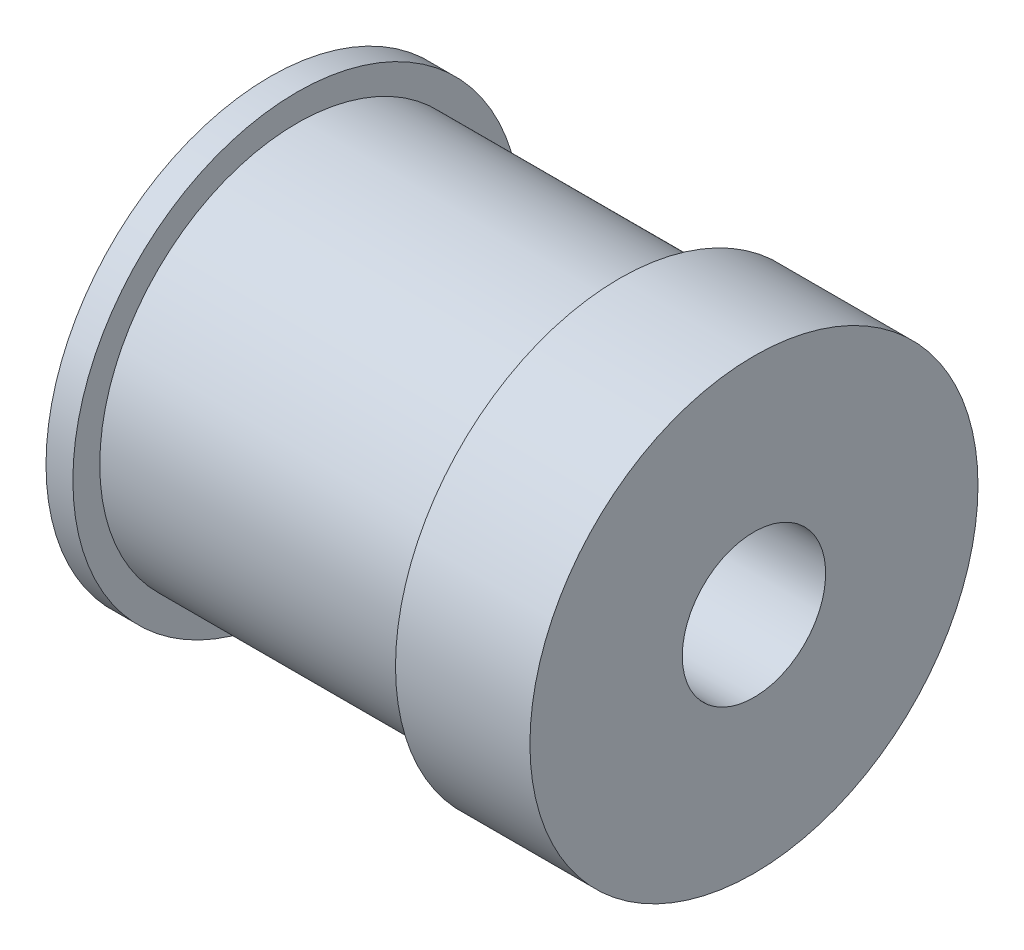
ISO-10303-21;
HEADER;
FILE_DESCRIPTION(('STEP AP214'),'2;1');
FILE_NAME('part.step','',(''),(''),'','','');
FILE_SCHEMA(('AUTOMOTIVE_DESIGN { 1 0 10303 214 1 1 1 1 }'));
ENDSEC;
DATA;
#1=APPLICATION_CONTEXT('core data for automotive mechanical design processes');
#2=APPLICATION_PROTOCOL_DEFINITION('international standard','automotive_design',2000,#1);
#3=PRODUCT_CONTEXT('',#1,'mechanical');
#4=PRODUCT('Part','Part','',(#3));
#5=PRODUCT_RELATED_PRODUCT_CATEGORY('part','',(#4));
#6=PRODUCT_DEFINITION_FORMATION('','',#4);
#7=PRODUCT_DEFINITION_CONTEXT('part definition',#1,'design');
#8=PRODUCT_DEFINITION('design','',#6,#7);
#9=PRODUCT_DEFINITION_SHAPE('','',#8);
#10=(LENGTH_UNIT() NAMED_UNIT(*) SI_UNIT(.MILLI.,.METRE.));
#11=(NAMED_UNIT(*) PLANE_ANGLE_UNIT() SI_UNIT($,.RADIAN.));
#12=(NAMED_UNIT(*) SI_UNIT($,.STERADIAN.) SOLID_ANGLE_UNIT());
#13=UNCERTAINTY_MEASURE_WITH_UNIT(LENGTH_MEASURE(1.E-05),#10,'distance_accuracy_value','');
#14=(GEOMETRIC_REPRESENTATION_CONTEXT(3) GLOBAL_UNCERTAINTY_ASSIGNED_CONTEXT((#13)) GLOBAL_UNIT_ASSIGNED_CONTEXT((#10,
#11,#12)) REPRESENTATION_CONTEXT('',''));
#15=CARTESIAN_POINT('',(0.,0.,0.));
#16=DIRECTION('',(0.,0.,1.));
#17=DIRECTION('',(1.,0.,0.));
#18=AXIS2_PLACEMENT_3D('',#15,#16,#17);
#19=CARTESIAN_POINT('',(33.7282166998161,11.,0.));
#20=DIRECTION('',(-1.,0.,0.));
#21=DIRECTION('',(0.,0.,1.));
#22=AXIS2_PLACEMENT_3D('',#19,#20,#21);
#23=PLANE('',#22);
#24=CARTESIAN_POINT('',(33.7282166998161,0.,0.));
#25=DIRECTION('',(-1.,0.,0.));
#26=DIRECTION('',(0.,0.,1.));
#27=AXIS2_PLACEMENT_3D('',#24,#25,#26);
#28=CIRCLE('',#27,12.5);
#29=CARTESIAN_POINT('',(33.7282166998161,0.,12.5));
#30=VERTEX_POINT('',#29);
#31=EDGE_CURVE('E10',#30,#30,#28,.T.);
#32=ORIENTED_EDGE('',*,*,#31,.F.);
#33=EDGE_LOOP('',(#32));
#34=FACE_BOUND('',#33,.T.);
#35=CARTESIAN_POINT('',(33.7282166998161,0.,0.));
#36=DIRECTION('',(-1.,0.,0.));
#37=DIRECTION('',(0.,0.,1.));
#38=AXIS2_PLACEMENT_3D('',#35,#36,#37);
#39=CIRCLE('',#38,11.);
#40=CARTESIAN_POINT('',(33.7282166998161,0.,11.));
#41=VERTEX_POINT('',#40);
#42=EDGE_CURVE('E74',#41,#41,#39,.T.);
#43=ORIENTED_EDGE('',*,*,#42,.T.);
#44=EDGE_LOOP('',(#43));
#45=FACE_BOUND('',#44,.T.);
#46=ADVANCED_FACE('F39',(#34,#45),#23,.F.);
#47=CARTESIAN_POINT('',(-58.1666151501891,0.,0.));
#48=DIRECTION('',(-1.,0.,0.));
#49=DIRECTION('',(0.,0.,1.));
#50=AXIS2_PLACEMENT_3D('',#47,#48,#49);
#51=CYLINDRICAL_SURFACE('',#50,12.5);
#52=CARTESIAN_POINT('',(32.2282166998161,0.,0.));
#53=DIRECTION('',(-1.,0.,0.));
#54=DIRECTION('',(0.,0.,1.));
#55=AXIS2_PLACEMENT_3D('',#52,#53,#54);
#56=CIRCLE('',#55,12.5);
#57=CARTESIAN_POINT('',(32.2282166998161,0.,12.5));
#58=VERTEX_POINT('',#57);
#59=EDGE_CURVE('E46',#58,#58,#56,.T.);
#60=ORIENTED_EDGE('',*,*,#59,.F.);
#61=EDGE_LOOP('',(#60));
#62=FACE_BOUND('',#61,.T.);
#63=ORIENTED_EDGE('',*,*,#31,.T.);
#64=EDGE_LOOP('',(#63));
#65=FACE_BOUND('',#64,.T.);
#66=ADVANCED_FACE('F112',(#62,#65),#51,.T.);
#67=CARTESIAN_POINT('',(32.2282166998161,4.0816703895743,0.));
#68=DIRECTION('',(1.,0.,0.));
#69=DIRECTION('',(0.,0.,-1.));
#70=AXIS2_PLACEMENT_3D('',#67,#68,#69);
#71=PLANE('',#70);
#72=CARTESIAN_POINT('',(32.2282166998161,0.,0.));
#73=DIRECTION('',(-1.,0.,0.));
#74=DIRECTION('',(0.,0.,1.));
#75=AXIS2_PLACEMENT_3D('',#72,#73,#74);
#76=CIRCLE('',#75,4.);
#77=CARTESIAN_POINT('',(32.2282166998161,0.,4.));
#78=VERTEX_POINT('',#77);
#79=EDGE_CURVE('E51',#78,#78,#76,.T.);
#80=ORIENTED_EDGE('',*,*,#79,.F.);
#81=EDGE_LOOP('',(#80));
#82=FACE_BOUND('',#81,.T.);
#83=ORIENTED_EDGE('',*,*,#59,.T.);
#84=EDGE_LOOP('',(#83));
#85=FACE_BOUND('',#84,.T.);
#86=ADVANCED_FACE('F107',(#82,#85),#71,.F.);
#87=CARTESIAN_POINT('',(-58.1666151501891,0.,0.));
#88=DIRECTION('',(-1.,0.,0.));
#89=DIRECTION('',(0.,0.,1.));
#90=AXIS2_PLACEMENT_3D('',#87,#88,#89);
#91=CYLINDRICAL_SURFACE('',#90,4.);
#92=CARTESIAN_POINT('',(59.2282166998161,0.,0.));
#93=DIRECTION('',(-1.,0.,0.));
#94=DIRECTION('',(0.,0.,1.));
#95=AXIS2_PLACEMENT_3D('',#92,#93,#94);
#96=CIRCLE('',#95,4.);
#97=CARTESIAN_POINT('',(59.2282166998161,0.,4.));
#98=VERTEX_POINT('',#97);
#99=EDGE_CURVE('E56',#98,#98,#96,.T.);
#100=ORIENTED_EDGE('',*,*,#99,.F.);
#101=EDGE_LOOP('',(#100));
#102=FACE_BOUND('',#101,.T.);
#103=ORIENTED_EDGE('',*,*,#79,.T.);
#104=EDGE_LOOP('',(#103));
#105=FACE_BOUND('',#104,.T.);
#106=ADVANCED_FACE('F101',(#102,#105),#91,.F.);
#107=CARTESIAN_POINT('',(59.2282166998161,12.5,0.));
#108=DIRECTION('',(-1.,0.,0.));
#109=DIRECTION('',(0.,0.,1.));
#110=AXIS2_PLACEMENT_3D('',#107,#108,#109);
#111=PLANE('',#110);
#112=CARTESIAN_POINT('',(59.2282166998161,0.,0.));
#113=DIRECTION('',(-1.,0.,0.));
#114=DIRECTION('',(0.,0.,1.));
#115=AXIS2_PLACEMENT_3D('',#112,#113,#114);
#116=CIRCLE('',#115,12.5);
#117=CARTESIAN_POINT('',(59.2282166998161,0.,12.5));
#118=VERTEX_POINT('',#117);
#119=EDGE_CURVE('E62',#118,#118,#116,.T.);
#120=ORIENTED_EDGE('',*,*,#119,.F.);
#121=EDGE_LOOP('',(#120));
#122=FACE_BOUND('',#121,.T.);
#123=ORIENTED_EDGE('',*,*,#99,.T.);
#124=EDGE_LOOP('',(#123));
#125=FACE_BOUND('',#124,.T.);
#126=ADVANCED_FACE('F95',(#122,#125),#111,.F.);
#127=CARTESIAN_POINT('',(-58.1666151501891,0.,0.));
#128=DIRECTION('',(-1.,0.,0.));
#129=DIRECTION('',(0.,0.,1.));
#130=AXIS2_PLACEMENT_3D('',#127,#128,#129);
#131=CYLINDRICAL_SURFACE('',#130,12.5);
#132=CARTESIAN_POINT('',(51.7282166998161,0.,0.));
#133=DIRECTION('',(-1.,0.,0.));
#134=DIRECTION('',(0.,0.,1.));
#135=AXIS2_PLACEMENT_3D('',#132,#133,#134);
#136=CIRCLE('',#135,12.5);
#137=CARTESIAN_POINT('',(51.7282166998161,0.,12.5));
#138=VERTEX_POINT('',#137);
#139=EDGE_CURVE('E66',#138,#138,#136,.T.);
#140=ORIENTED_EDGE('',*,*,#139,.F.);
#141=EDGE_LOOP('',(#140));
#142=FACE_BOUND('',#141,.T.);
#143=ORIENTED_EDGE('',*,*,#119,.T.);
#144=EDGE_LOOP('',(#143));
#145=FACE_BOUND('',#144,.T.);
#146=ADVANCED_FACE('F89',(#142,#145),#131,.T.);
#147=CARTESIAN_POINT('',(51.7282166998161,12.5,0.));
#148=DIRECTION('',(1.,0.,0.));
#149=DIRECTION('',(0.,0.,-1.));
#150=AXIS2_PLACEMENT_3D('',#147,#148,#149);
#151=PLANE('',#150);
#152=CARTESIAN_POINT('',(51.7282166998161,0.,0.));
#153=DIRECTION('',(-1.,0.,0.));
#154=DIRECTION('',(0.,0.,1.));
#155=AXIS2_PLACEMENT_3D('',#152,#153,#154);
#156=CIRCLE('',#155,11.);
#157=CARTESIAN_POINT('',(51.7282166998161,0.,11.));
#158=VERTEX_POINT('',#157);
#159=EDGE_CURVE('E70',#158,#158,#156,.T.);
#160=ORIENTED_EDGE('',*,*,#159,.F.);
#161=EDGE_LOOP('',(#160));
#162=FACE_BOUND('',#161,.T.);
#163=ORIENTED_EDGE('',*,*,#139,.T.);
#164=EDGE_LOOP('',(#163));
#165=FACE_BOUND('',#164,.T.);
#166=ADVANCED_FACE('F83',(#162,#165),#151,.F.);
#167=CARTESIAN_POINT('',(-58.1666151501891,0.,0.));
#168=DIRECTION('',(-1.,0.,0.));
#169=DIRECTION('',(0.,0.,1.));
#170=AXIS2_PLACEMENT_3D('',#167,#168,#169);
#171=CYLINDRICAL_SURFACE('',#170,11.);
#172=ORIENTED_EDGE('',*,*,#42,.F.);
#173=EDGE_LOOP('',(#172));
#174=FACE_BOUND('',#173,.T.);
#175=ORIENTED_EDGE('',*,*,#159,.T.);
#176=EDGE_LOOP('',(#175));
#177=FACE_BOUND('',#176,.T.);
#178=ADVANCED_FACE('F80',(#174,#177),#171,.T.);
#179=CLOSED_SHELL('',(#46,#66,#86,#106,#126,#146,#166,#178));
#180=MANIFOLD_SOLID_BREP('B2',#179);
#181=ADVANCED_BREP_SHAPE_REPRESENTATION('',(#18,#180),#14);
#182=SHAPE_DEFINITION_REPRESENTATION(#9,#181);
ENDSEC;
END-ISO-10303-21;
